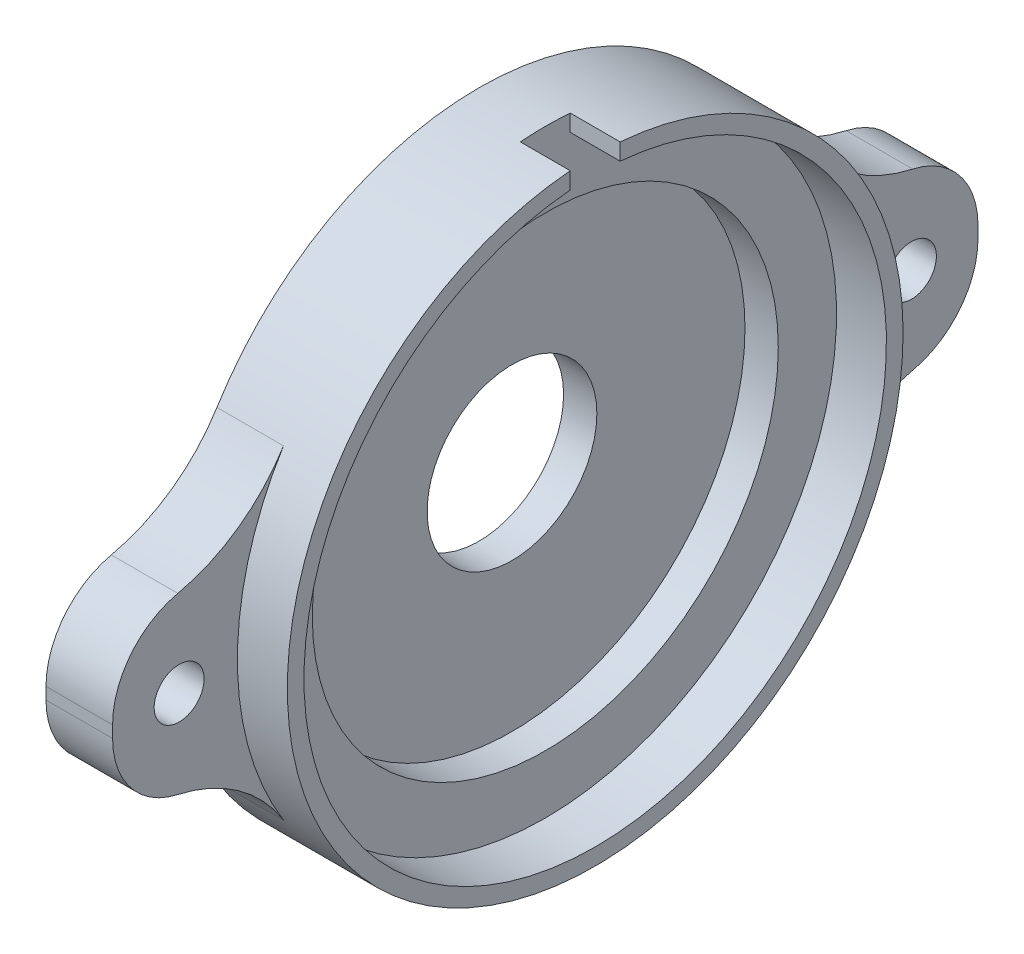
ISO-10303-21;
HEADER;
FILE_DESCRIPTION(('STEP AP214'),'2;1');
FILE_NAME('part.step','',(''),(''),'','','');
FILE_SCHEMA(('AUTOMOTIVE_DESIGN { 1 0 10303 214 1 1 1 1 }'));
ENDSEC;
DATA;
#1=APPLICATION_CONTEXT('core data for automotive mechanical design processes');
#2=APPLICATION_PROTOCOL_DEFINITION('international standard','automotive_design',2000,#1);
#3=PRODUCT_CONTEXT('',#1,'mechanical');
#4=PRODUCT('Part','Part','',(#3));
#5=PRODUCT_RELATED_PRODUCT_CATEGORY('part','',(#4));
#6=PRODUCT_DEFINITION_FORMATION('','',#4);
#7=PRODUCT_DEFINITION_CONTEXT('part definition',#1,'design');
#8=PRODUCT_DEFINITION('design','',#6,#7);
#9=PRODUCT_DEFINITION_SHAPE('','',#8);
#10=(LENGTH_UNIT() NAMED_UNIT(*) SI_UNIT(.MILLI.,.METRE.));
#11=(NAMED_UNIT(*) PLANE_ANGLE_UNIT() SI_UNIT($,.RADIAN.));
#12=(NAMED_UNIT(*) SI_UNIT($,.STERADIAN.) SOLID_ANGLE_UNIT());
#13=UNCERTAINTY_MEASURE_WITH_UNIT(LENGTH_MEASURE(1.E-05),#10,'distance_accuracy_value','');
#14=(GEOMETRIC_REPRESENTATION_CONTEXT(3) GLOBAL_UNCERTAINTY_ASSIGNED_CONTEXT((#13)) GLOBAL_UNIT_ASSIGNED_CONTEXT((#10,
#11,#12)) REPRESENTATION_CONTEXT('',''));
#15=CARTESIAN_POINT('',(0.,0.,0.));
#16=DIRECTION('',(0.,0.,1.));
#17=DIRECTION('',(1.,0.,0.));
#18=AXIS2_PLACEMENT_3D('',#15,#16,#17);
#19=CARTESIAN_POINT('',(7.,0.,0.));
#20=DIRECTION('',(-1.,0.,0.));
#21=DIRECTION('',(0.,0.,1.));
#22=AXIS2_PLACEMENT_3D('',#19,#20,#21);
#23=CYLINDRICAL_SURFACE('',#22,18.5);
#24=CARTESIAN_POINT('',(7.,0.,0.));
#25=DIRECTION('',(1.,0.,0.));
#26=DIRECTION('',(0.,0.,-1.));
#27=AXIS2_PLACEMENT_3D('',#24,#25,#26);
#28=CIRCLE('',#27,18.5);
#29=CARTESIAN_POINT('',(7.,18.4390889145858,1.5));
#30=VERTEX_POINT('',#29);
#31=CARTESIAN_POINT('',(7.,18.4390889145858,-1.5));
#32=VERTEX_POINT('',#31);
#33=EDGE_CURVE('E219',#30,#32,#28,.T.);
#34=ORIENTED_EDGE('',*,*,#33,.F.);
#35=DIRECTION('',(-1.,0.,0.));
#36=VECTOR('',#35,1.);
#37=CARTESIAN_POINT('',(7.,18.4390889145858,1.5));
#38=LINE('',#37,#36);
#39=CARTESIAN_POINT('',(4.,18.4390889145858,1.5));
#40=VERTEX_POINT('',#39);
#41=EDGE_CURVE('E173',#30,#40,#38,.T.);
#42=ORIENTED_EDGE('',*,*,#41,.T.);
#43=CARTESIAN_POINT('',(4.,0.,0.));
#44=DIRECTION('',(1.,0.,0.));
#45=DIRECTION('',(0.,0.,-1.));
#46=AXIS2_PLACEMENT_3D('',#43,#44,#45);
#47=CIRCLE('',#46,18.5);
#48=CARTESIAN_POINT('',(4.,18.4390889145858,-1.5));
#49=VERTEX_POINT('',#48);
#50=EDGE_CURVE('E167',#49,#40,#47,.T.);
#51=ORIENTED_EDGE('',*,*,#50,.F.);
#52=DIRECTION('',(-1.,0.,0.));
#53=VECTOR('',#52,1.);
#54=CARTESIAN_POINT('',(7.,18.4390889145858,-1.5));
#55=LINE('',#54,#53);
#56=EDGE_CURVE('E151',#49,#32,#55,.F.);
#57=ORIENTED_EDGE('',*,*,#56,.T.);
#58=EDGE_LOOP('',(#34,#42,#51,#57));
#59=FACE_BOUND('',#58,.T.);
#60=CARTESIAN_POINT('',(4.,0.,0.));
#61=DIRECTION('',(-1.,0.,0.));
#62=DIRECTION('',(0.,0.,1.));
#63=AXIS2_PLACEMENT_3D('',#60,#61,#62);
#64=CIRCLE('',#63,18.5);
#65=CARTESIAN_POINT('',(4.,9.73684210526315,-15.7303498313666));
#66=VERTEX_POINT('',#65);
#67=CARTESIAN_POINT('',(4.,-9.73684210526316,-15.7303498313666));
#68=VERTEX_POINT('',#67);
#69=EDGE_CURVE('E226',#66,#68,#64,.T.);
#70=ORIENTED_EDGE('',*,*,#69,.F.);
#71=DIRECTION('',(-1.,0.,0.));
#72=VECTOR('',#71,1.);
#73=CARTESIAN_POINT('',(7.,9.73684210526315,-15.7303498313666));
#74=LINE('',#73,#72);
#75=CARTESIAN_POINT('',(0.,9.73684210526315,-15.7303498313666));
#76=VERTEX_POINT('',#75);
#77=EDGE_CURVE('E236',#66,#76,#74,.T.);
#78=ORIENTED_EDGE('',*,*,#77,.T.);
#79=CARTESIAN_POINT('',(0.,0.,0.));
#80=DIRECTION('',(1.,0.,0.));
#81=DIRECTION('',(0.,0.,-1.));
#82=AXIS2_PLACEMENT_3D('',#79,#80,#81);
#83=CIRCLE('',#82,18.5);
#84=CARTESIAN_POINT('',(0.,9.73684210526316,15.7303498313666));
#85=VERTEX_POINT('',#84);
#86=EDGE_CURVE('E222',#76,#85,#83,.T.);
#87=ORIENTED_EDGE('',*,*,#86,.T.);
#88=DIRECTION('',(-1.,0.,0.));
#89=VECTOR('',#88,1.);
#90=CARTESIAN_POINT('',(7.,9.73684210526316,15.7303498313666));
#91=LINE('',#90,#89);
#92=CARTESIAN_POINT('',(4.,9.73684210526316,15.7303498313666));
#93=VERTEX_POINT('',#92);
#94=EDGE_CURVE('E227',#85,#93,#91,.F.);
#95=ORIENTED_EDGE('',*,*,#94,.T.);
#96=CARTESIAN_POINT('',(4.,-9.73684210526316,15.7303498313666));
#97=VERTEX_POINT('',#96);
#98=EDGE_CURVE('E221',#97,#93,#64,.T.);
#99=ORIENTED_EDGE('',*,*,#98,.F.);
#100=DIRECTION('',(-1.,0.,0.));
#101=VECTOR('',#100,1.);
#102=CARTESIAN_POINT('',(7.,-9.73684210526316,15.7303498313666));
#103=LINE('',#102,#101);
#104=CARTESIAN_POINT('',(0.,-9.73684210526316,15.7303498313666));
#105=VERTEX_POINT('',#104);
#106=EDGE_CURVE('E230',#97,#105,#103,.T.);
#107=ORIENTED_EDGE('',*,*,#106,.T.);
#108=CARTESIAN_POINT('',(0.,-9.73684210526316,-15.7303498313666));
#109=VERTEX_POINT('',#108);
#110=EDGE_CURVE('E214',#105,#109,#83,.T.);
#111=ORIENTED_EDGE('',*,*,#110,.T.);
#112=DIRECTION('',(-1.,0.,0.));
#113=VECTOR('',#112,1.);
#114=CARTESIAN_POINT('',(7.,-9.73684210526316,-15.7303498313666));
#115=LINE('',#114,#113);
#116=EDGE_CURVE('E233',#109,#68,#115,.F.);
#117=ORIENTED_EDGE('',*,*,#116,.T.);
#118=EDGE_LOOP('',(#70,#78,#87,#95,#99,#107,#111,#117));
#119=FACE_BOUND('',#118,.T.);
#120=ADVANCED_FACE('F37',(#59,#119),#23,.T.);
#121=CARTESIAN_POINT('',(7.,0.,0.));
#122=DIRECTION('',(1.,0.,0.));
#123=DIRECTION('',(0.,0.,-1.));
#124=AXIS2_PLACEMENT_3D('',#121,#122,#123);
#125=PLANE('',#124);
#126=DIRECTION('',(0.,-1.,0.));
#127=VECTOR('',#126,1.);
#128=CARTESIAN_POINT('',(7.,19.1883057553872,1.5));
#129=LINE('',#128,#127);
#130=CARTESIAN_POINT('',(7.,17.4355957741627,1.5));
#131=VERTEX_POINT('',#130);
#132=EDGE_CURVE('E575',#30,#131,#129,.T.);
#133=ORIENTED_EDGE('',*,*,#132,.F.);
#134=ORIENTED_EDGE('',*,*,#33,.T.);
#135=DIRECTION('',(0.,1.,0.));
#136=VECTOR('',#135,1.);
#137=CARTESIAN_POINT('',(7.,19.1883057553872,-1.5));
#138=LINE('',#137,#136);
#139=CARTESIAN_POINT('',(7.,17.4355957741627,-1.5));
#140=VERTEX_POINT('',#139);
#141=EDGE_CURVE('E157',#140,#32,#138,.T.);
#142=ORIENTED_EDGE('',*,*,#141,.F.);
#143=CARTESIAN_POINT('',(7.,0.,0.));
#144=DIRECTION('',(1.,0.,0.));
#145=DIRECTION('',(0.,0.,-1.));
#146=AXIS2_PLACEMENT_3D('',#143,#144,#145);
#147=CIRCLE('',#146,17.5);
#148=EDGE_CURVE('E200',#131,#140,#147,.T.);
#149=ORIENTED_EDGE('',*,*,#148,.F.);
#150=EDGE_LOOP('',(#133,#134,#142,#149));
#151=FACE_BOUND('',#150,.T.);
#152=ADVANCED_FACE('F349',(#151),#125,.T.);
#153=CARTESIAN_POINT('',(0.,0.,0.));
#154=DIRECTION('',(1.,0.,0.));
#155=DIRECTION('',(0.,0.,-1.));
#156=AXIS2_PLACEMENT_3D('',#153,#154,#155);
#157=PLANE('',#156);
#158=CARTESIAN_POINT('',(0.,0.,22.));
#159=DIRECTION('',(1.,0.,0.));
#160=DIRECTION('',(0.,0.,-1.));
#161=AXIS2_PLACEMENT_3D('',#158,#159,#160);
#162=CIRCLE('',#161,1.5);
#163=CARTESIAN_POINT('',(0.,0.,20.5));
#164=VERTEX_POINT('',#163);
#165=EDGE_CURVE('E185',#164,#164,#162,.F.);
#166=ORIENTED_EDGE('',*,*,#165,.F.);
#167=EDGE_LOOP('',(#166));
#168=FACE_BOUND('',#167,.T.);
#169=CARTESIAN_POINT('',(0.,0.,-22.));
#170=DIRECTION('',(1.,0.,0.));
#171=DIRECTION('',(0.,0.,-1.));
#172=AXIS2_PLACEMENT_3D('',#169,#170,#171);
#173=CIRCLE('',#172,1.5);
#174=CARTESIAN_POINT('',(0.,0.,-23.5));
#175=VERTEX_POINT('',#174);
#176=EDGE_CURVE('E177',#175,#175,#173,.F.);
#177=ORIENTED_EDGE('',*,*,#176,.F.);
#178=EDGE_LOOP('',(#177));
#179=FACE_BOUND('',#178,.T.);
#180=CARTESIAN_POINT('',(0.,0.,0.));
#181=DIRECTION('',(1.,0.,0.));
#182=DIRECTION('',(0.,0.,-1.));
#183=AXIS2_PLACEMENT_3D('',#180,#181,#182);
#184=CIRCLE('',#183,5.1);
#185=CARTESIAN_POINT('',(0.,0.,-5.1));
#186=VERTEX_POINT('',#185);
#187=EDGE_CURVE('E193',#186,#186,#184,.F.);
#188=ORIENTED_EDGE('',*,*,#187,.F.);
#189=EDGE_LOOP('',(#188));
#190=FACE_BOUND('',#189,.T.);
#191=DIRECTION('',(0.,1.,0.));
#192=VECTOR('',#191,1.);
#193=CARTESIAN_POINT('',(0.,5.,26.));
#194=LINE('',#193,#192);
#195=CARTESIAN_POINT('',(0.,-0.352606083387349,26.));
#196=VERTEX_POINT('',#195);
#197=CARTESIAN_POINT('',(0.,0.352606083387353,26.));
#198=VERTEX_POINT('',#197);
#199=EDGE_CURVE('E211',#196,#198,#194,.T.);
#200=ORIENTED_EDGE('',*,*,#199,.T.);
#201=CARTESIAN_POINT('',(0.,0.352606083387353,21.));
#202=DIRECTION('',(1.,0.,0.));
#203=DIRECTION('',(0.,0.,-1.));
#204=AXIS2_PLACEMENT_3D('',#201,#202,#203);
#205=CIRCLE('',#204,5.);
#206=CARTESIAN_POINT('',(0.,5.23507072225824,22.0777472107018));
#207=VERTEX_POINT('',#206);
#208=EDGE_CURVE('E270',#198,#207,#205,.F.);
#209=ORIENTED_EDGE('',*,*,#208,.T.);
#210=CARTESIAN_POINT('',(0.,15.,24.2332416321053));
#211=DIRECTION('',(1.,0.,0.));
#212=DIRECTION('',(0.,0.,-1.));
#213=AXIS2_PLACEMENT_3D('',#210,#211,#212);
#214=CIRCLE('',#213,10.);
#215=EDGE_CURVE('E257',#207,#85,#214,.T.);
#216=ORIENTED_EDGE('',*,*,#215,.T.);
#217=ORIENTED_EDGE('',*,*,#86,.F.);
#218=CARTESIAN_POINT('',(0.,15.,-24.2332416321053));
#219=DIRECTION('',(1.,0.,0.));
#220=DIRECTION('',(0.,0.,-1.));
#221=AXIS2_PLACEMENT_3D('',#218,#219,#220);
#222=CIRCLE('',#221,10.);
#223=CARTESIAN_POINT('',(0.,5.23507072225823,-22.0777472107018));
#224=VERTEX_POINT('',#223);
#225=EDGE_CURVE('E239',#76,#224,#222,.T.);
#226=ORIENTED_EDGE('',*,*,#225,.T.);
#227=CARTESIAN_POINT('',(0.,0.352606083387347,-21.));
#228=DIRECTION('',(1.,0.,0.));
#229=DIRECTION('',(0.,0.,-1.));
#230=AXIS2_PLACEMENT_3D('',#227,#228,#229);
#231=CIRCLE('',#230,5.);
#232=CARTESIAN_POINT('',(0.,0.352606083387347,-26.));
#233=VERTEX_POINT('',#232);
#234=EDGE_CURVE('E264',#224,#233,#231,.F.);
#235=ORIENTED_EDGE('',*,*,#234,.T.);
#236=DIRECTION('',(0.,-1.,0.));
#237=VECTOR('',#236,1.);
#238=CARTESIAN_POINT('',(0.,5.,-26.));
#239=LINE('',#238,#237);
#240=CARTESIAN_POINT('',(0.,-0.352606083387349,-26.));
#241=VERTEX_POINT('',#240);
#242=EDGE_CURVE('E204',#233,#241,#239,.T.);
#243=ORIENTED_EDGE('',*,*,#242,.T.);
#244=CARTESIAN_POINT('',(0.,-0.352606083387349,-21.));
#245=DIRECTION('',(1.,0.,0.));
#246=DIRECTION('',(0.,0.,-1.));
#247=AXIS2_PLACEMENT_3D('',#244,#245,#246);
#248=CIRCLE('',#247,5.);
#249=CARTESIAN_POINT('',(0.,-5.23507072225823,-22.0777472107018));
#250=VERTEX_POINT('',#249);
#251=EDGE_CURVE('E266',#241,#250,#248,.F.);
#252=ORIENTED_EDGE('',*,*,#251,.T.);
#253=CARTESIAN_POINT('',(0.,-15.,-24.2332416321053));
#254=DIRECTION('',(1.,0.,0.));
#255=DIRECTION('',(0.,0.,-1.));
#256=AXIS2_PLACEMENT_3D('',#253,#254,#255);
#257=CIRCLE('',#256,10.);
#258=EDGE_CURVE('E247',#250,#109,#257,.T.);
#259=ORIENTED_EDGE('',*,*,#258,.T.);
#260=ORIENTED_EDGE('',*,*,#110,.F.);
#261=CARTESIAN_POINT('',(0.,-15.,24.2332416321053));
#262=DIRECTION('',(1.,0.,0.));
#263=DIRECTION('',(0.,0.,-1.));
#264=AXIS2_PLACEMENT_3D('',#261,#262,#263);
#265=CIRCLE('',#264,10.);
#266=CARTESIAN_POINT('',(0.,-5.23507072225823,22.0777472107018));
#267=VERTEX_POINT('',#266);
#268=EDGE_CURVE('E249',#105,#267,#265,.T.);
#269=ORIENTED_EDGE('',*,*,#268,.T.);
#270=CARTESIAN_POINT('',(0.,-0.352606083387349,21.));
#271=DIRECTION('',(1.,0.,0.));
#272=DIRECTION('',(0.,0.,-1.));
#273=AXIS2_PLACEMENT_3D('',#270,#271,#272);
#274=CIRCLE('',#273,5.);
#275=EDGE_CURVE('E268',#267,#196,#274,.F.);
#276=ORIENTED_EDGE('',*,*,#275,.T.);
#277=EDGE_LOOP('',(#200,#209,#216,#217,#226,#235,#243,#252,#259,#260,#269,#276));
#278=FACE_BOUND('',#277,.T.);
#279=ADVANCED_FACE('F301',(#168,#179,#190,#278),#157,.F.);
#280=CARTESIAN_POINT('',(4.,5.,26.));
#281=DIRECTION('',(0.,0.,1.));
#282=DIRECTION('',(1.,0.,0.));
#283=AXIS2_PLACEMENT_3D('',#280,#281,#282);
#284=PLANE('',#283);
#285=DIRECTION('',(0.,1.,0.));
#286=VECTOR('',#285,1.);
#287=CARTESIAN_POINT('',(4.,5.,26.));
#288=LINE('',#287,#286);
#289=CARTESIAN_POINT('',(4.,-0.352606083387349,26.));
#290=VERTEX_POINT('',#289);
#291=CARTESIAN_POINT('',(4.,0.352606083387353,26.));
#292=VERTEX_POINT('',#291);
#293=EDGE_CURVE('E210',#290,#292,#288,.T.);
#294=ORIENTED_EDGE('',*,*,#293,.T.);
#295=DIRECTION('',(1.,0.,0.));
#296=VECTOR('',#295,1.);
#297=CARTESIAN_POINT('',(0.,0.352606083387353,26.));
#298=LINE('',#297,#296);
#299=EDGE_CURVE('E261',#292,#198,#298,.F.);
#300=ORIENTED_EDGE('',*,*,#299,.T.);
#301=ORIENTED_EDGE('',*,*,#199,.F.);
#302=DIRECTION('',(1.,0.,0.));
#303=VECTOR('',#302,1.);
#304=CARTESIAN_POINT('',(4.,-0.352606083387349,26.));
#305=LINE('',#304,#303);
#306=EDGE_CURVE('E259',#196,#290,#305,.T.);
#307=ORIENTED_EDGE('',*,*,#306,.T.);
#308=EDGE_LOOP('',(#294,#300,#301,#307));
#309=FACE_BOUND('',#308,.T.);
#310=ADVANCED_FACE('F321',(#309),#284,.T.);
#311=CARTESIAN_POINT('',(4.,0.,0.));
#312=DIRECTION('',(-1.,0.,0.));
#313=DIRECTION('',(0.,0.,1.));
#314=AXIS2_PLACEMENT_3D('',#311,#312,#313);
#315=PLANE('',#314);
#316=CARTESIAN_POINT('',(4.,0.,22.));
#317=DIRECTION('',(1.,0.,0.));
#318=DIRECTION('',(0.,0.,-1.));
#319=AXIS2_PLACEMENT_3D('',#316,#317,#318);
#320=CIRCLE('',#319,1.5);
#321=CARTESIAN_POINT('',(4.,0.,20.5));
#322=VERTEX_POINT('',#321);
#323=EDGE_CURVE('E182',#322,#322,#320,.T.);
#324=ORIENTED_EDGE('',*,*,#323,.F.);
#325=EDGE_LOOP('',(#324));
#326=FACE_BOUND('',#325,.T.);
#327=CARTESIAN_POINT('',(4.,15.,24.2332416321053));
#328=DIRECTION('',(-1.,0.,0.));
#329=DIRECTION('',(0.,0.,1.));
#330=AXIS2_PLACEMENT_3D('',#327,#328,#329);
#331=CIRCLE('',#330,10.);
#332=CARTESIAN_POINT('',(4.,5.23507072225824,22.0777472107018));
#333=VERTEX_POINT('',#332);
#334=EDGE_CURVE('E254',#93,#333,#331,.T.);
#335=ORIENTED_EDGE('',*,*,#334,.T.);
#336=CARTESIAN_POINT('',(4.,0.352606083387353,21.));
#337=DIRECTION('',(-1.,0.,0.));
#338=DIRECTION('',(0.,0.,1.));
#339=AXIS2_PLACEMENT_3D('',#336,#337,#338);
#340=CIRCLE('',#339,5.);
#341=EDGE_CURVE('E276',#333,#292,#340,.F.);
#342=ORIENTED_EDGE('',*,*,#341,.T.);
#343=ORIENTED_EDGE('',*,*,#293,.F.);
#344=CARTESIAN_POINT('',(4.,-0.352606083387349,21.));
#345=DIRECTION('',(-1.,0.,0.));
#346=DIRECTION('',(0.,0.,1.));
#347=AXIS2_PLACEMENT_3D('',#344,#345,#346);
#348=CIRCLE('',#347,5.);
#349=CARTESIAN_POINT('',(4.,-5.23507072225823,22.0777472107018));
#350=VERTEX_POINT('',#349);
#351=EDGE_CURVE('E274',#290,#350,#348,.F.);
#352=ORIENTED_EDGE('',*,*,#351,.T.);
#353=CARTESIAN_POINT('',(4.,-15.,24.2332416321053));
#354=DIRECTION('',(-1.,0.,0.));
#355=DIRECTION('',(0.,0.,1.));
#356=AXIS2_PLACEMENT_3D('',#353,#354,#355);
#357=CIRCLE('',#356,10.);
#358=EDGE_CURVE('E252',#350,#97,#357,.T.);
#359=ORIENTED_EDGE('',*,*,#358,.T.);
#360=ORIENTED_EDGE('',*,*,#98,.T.);
#361=EDGE_LOOP('',(#335,#342,#343,#352,#359,#360));
#362=FACE_BOUND('',#361,.T.);
#363=ADVANCED_FACE('F324',(#326,#362),#315,.F.);
#364=CARTESIAN_POINT('',(4.,0.,-22.));
#365=DIRECTION('',(1.,0.,0.));
#366=DIRECTION('',(0.,0.,-1.));
#367=AXIS2_PLACEMENT_3D('',#364,#365,#366);
#368=CIRCLE('',#367,1.5);
#369=CARTESIAN_POINT('',(4.,0.,-23.5));
#370=VERTEX_POINT('',#369);
#371=EDGE_CURVE('E174',#370,#370,#368,.T.);
#372=ORIENTED_EDGE('',*,*,#371,.F.);
#373=EDGE_LOOP('',(#372));
#374=FACE_BOUND('',#373,.T.);
#375=CARTESIAN_POINT('',(4.,-15.,-24.2332416321053));
#376=DIRECTION('',(-1.,0.,0.));
#377=DIRECTION('',(0.,0.,1.));
#378=AXIS2_PLACEMENT_3D('',#375,#376,#377);
#379=CIRCLE('',#378,10.);
#380=CARTESIAN_POINT('',(4.,-5.23507072225823,-22.0777472107018));
#381=VERTEX_POINT('',#380);
#382=EDGE_CURVE('E244',#68,#381,#379,.T.);
#383=ORIENTED_EDGE('',*,*,#382,.T.);
#384=CARTESIAN_POINT('',(4.,-0.352606083387349,-21.));
#385=DIRECTION('',(-1.,0.,0.));
#386=DIRECTION('',(0.,0.,1.));
#387=AXIS2_PLACEMENT_3D('',#384,#385,#386);
#388=CIRCLE('',#387,5.);
#389=CARTESIAN_POINT('',(4.,-0.352606083387349,-26.));
#390=VERTEX_POINT('',#389);
#391=EDGE_CURVE('E45',#381,#390,#388,.F.);
#392=ORIENTED_EDGE('',*,*,#391,.T.);
#393=DIRECTION('',(0.,-1.,0.));
#394=VECTOR('',#393,1.);
#395=CARTESIAN_POINT('',(4.,5.,-26.));
#396=LINE('',#395,#394);
#397=CARTESIAN_POINT('',(4.,0.352606083387347,-26.));
#398=VERTEX_POINT('',#397);
#399=EDGE_CURVE('E207',#398,#390,#396,.T.);
#400=ORIENTED_EDGE('',*,*,#399,.F.);
#401=CARTESIAN_POINT('',(4.,0.352606083387347,-21.));
#402=DIRECTION('',(-1.,0.,0.));
#403=DIRECTION('',(0.,0.,1.));
#404=AXIS2_PLACEMENT_3D('',#401,#402,#403);
#405=CIRCLE('',#404,5.);
#406=CARTESIAN_POINT('',(4.,5.23507072225823,-22.0777472107018));
#407=VERTEX_POINT('',#406);
#408=EDGE_CURVE('E60',#398,#407,#405,.F.);
#409=ORIENTED_EDGE('',*,*,#408,.T.);
#410=CARTESIAN_POINT('',(4.,15.,-24.2332416321053));
#411=DIRECTION('',(-1.,0.,0.));
#412=DIRECTION('',(0.,0.,1.));
#413=AXIS2_PLACEMENT_3D('',#410,#411,#412);
#414=CIRCLE('',#413,10.);
#415=EDGE_CURVE('E242',#407,#66,#414,.T.);
#416=ORIENTED_EDGE('',*,*,#415,.T.);
#417=ORIENTED_EDGE('',*,*,#69,.T.);
#418=EDGE_LOOP('',(#383,#392,#400,#409,#416,#417));
#419=FACE_BOUND('',#418,.T.);
#420=ADVANCED_FACE('F289',(#374,#419),#315,.F.);
#421=CARTESIAN_POINT('',(4.,5.,-26.));
#422=DIRECTION('',(0.,0.,-1.));
#423=DIRECTION('',(-1.,0.,0.));
#424=AXIS2_PLACEMENT_3D('',#421,#422,#423);
#425=PLANE('',#424);
#426=ORIENTED_EDGE('',*,*,#399,.T.);
#427=DIRECTION('',(1.,0.,0.));
#428=VECTOR('',#427,1.);
#429=CARTESIAN_POINT('',(0.,-0.352606083387349,-26.));
#430=LINE('',#429,#428);
#431=EDGE_CURVE('E283',#390,#241,#430,.F.);
#432=ORIENTED_EDGE('',*,*,#431,.T.);
#433=ORIENTED_EDGE('',*,*,#242,.F.);
#434=DIRECTION('',(1.,0.,0.));
#435=VECTOR('',#434,1.);
#436=CARTESIAN_POINT('',(4.,0.352606083387347,-26.));
#437=LINE('',#436,#435);
#438=EDGE_CURVE('E281',#233,#398,#437,.T.);
#439=ORIENTED_EDGE('',*,*,#438,.T.);
#440=EDGE_LOOP('',(#426,#432,#433,#439));
#441=FACE_BOUND('',#440,.T.);
#442=ADVANCED_FACE('F295',(#441),#425,.T.);
#443=CARTESIAN_POINT('',(4.,0.,0.));
#444=DIRECTION('',(1.,0.,0.));
#445=DIRECTION('',(0.,0.,-1.));
#446=AXIS2_PLACEMENT_3D('',#443,#444,#445);
#447=CYLINDRICAL_SURFACE('',#446,17.5);
#448=CARTESIAN_POINT('',(4.,0.,0.));
#449=DIRECTION('',(1.,0.,0.));
#450=DIRECTION('',(0.,0.,-1.));
#451=AXIS2_PLACEMENT_3D('',#448,#449,#450);
#452=CIRCLE('',#451,17.5);
#453=CARTESIAN_POINT('',(4.,17.4355957741627,1.5));
#454=VERTEX_POINT('',#453);
#455=CARTESIAN_POINT('',(4.,17.4355957741627,-1.5));
#456=VERTEX_POINT('',#455);
#457=EDGE_CURVE('E169',#454,#456,#452,.T.);
#458=ORIENTED_EDGE('',*,*,#457,.F.);
#459=DIRECTION('',(1.,0.,0.));
#460=VECTOR('',#459,1.);
#461=CARTESIAN_POINT('',(4.,17.4355957741627,1.5));
#462=LINE('',#461,#460);
#463=EDGE_CURVE('E162',#454,#131,#462,.T.);
#464=ORIENTED_EDGE('',*,*,#463,.T.);
#465=ORIENTED_EDGE('',*,*,#148,.T.);
#466=DIRECTION('',(1.,0.,0.));
#467=VECTOR('',#466,1.);
#468=CARTESIAN_POINT('',(4.,17.4355957741627,-1.5));
#469=LINE('',#468,#467);
#470=EDGE_CURVE('E163',#140,#456,#469,.F.);
#471=ORIENTED_EDGE('',*,*,#470,.T.);
#472=EDGE_LOOP('',(#458,#464,#465,#471));
#473=FACE_BOUND('',#472,.T.);
#474=ADVANCED_FACE('F400',(#473),#447,.F.);
#475=CARTESIAN_POINT('',(4.,0.,0.));
#476=DIRECTION('',(1.,0.,0.));
#477=DIRECTION('',(0.,0.,-1.));
#478=AXIS2_PLACEMENT_3D('',#475,#476,#477);
#479=PLANE('',#478);
#480=ORIENTED_EDGE('',*,*,#457,.T.);
#481=DIRECTION('',(0.,-1.,0.));
#482=VECTOR('',#481,1.);
#483=CARTESIAN_POINT('',(4.,19.1883057553872,-1.5));
#484=LINE('',#483,#482);
#485=EDGE_CURVE('E154',#49,#456,#484,.T.);
#486=ORIENTED_EDGE('',*,*,#485,.F.);
#487=ORIENTED_EDGE('',*,*,#50,.T.);
#488=DIRECTION('',(0.,1.,0.));
#489=VECTOR('',#488,1.);
#490=CARTESIAN_POINT('',(4.,19.1883057553872,1.5));
#491=LINE('',#490,#489);
#492=EDGE_CURVE('E52',#454,#40,#491,.T.);
#493=ORIENTED_EDGE('',*,*,#492,.F.);
#494=EDGE_LOOP('',(#480,#486,#487,#493));
#495=FACE_BOUND('',#494,.T.);
#496=CARTESIAN_POINT('',(4.,0.,0.));
#497=DIRECTION('',(1.,0.,0.));
#498=DIRECTION('',(0.,0.,-1.));
#499=AXIS2_PLACEMENT_3D('',#496,#497,#498);
#500=CIRCLE('',#499,14.);
#501=CARTESIAN_POINT('',(4.,0.,-14.));
#502=VERTEX_POINT('',#501);
#503=EDGE_CURVE('E196',#502,#502,#500,.T.);
#504=ORIENTED_EDGE('',*,*,#503,.F.);
#505=EDGE_LOOP('',(#504));
#506=FACE_BOUND('',#505,.T.);
#507=ADVANCED_FACE('F165',(#495,#506),#479,.T.);
#508=CARTESIAN_POINT('',(2.,0.,0.));
#509=DIRECTION('',(1.,0.,0.));
#510=DIRECTION('',(0.,0.,-1.));
#511=AXIS2_PLACEMENT_3D('',#508,#509,#510);
#512=CYLINDRICAL_SURFACE('',#511,14.);
#513=CARTESIAN_POINT('',(2.,0.,0.));
#514=DIRECTION('',(1.,0.,0.));
#515=DIRECTION('',(0.,0.,-1.));
#516=AXIS2_PLACEMENT_3D('',#513,#514,#515);
#517=CIRCLE('',#516,14.);
#518=CARTESIAN_POINT('',(2.,0.,-14.));
#519=VERTEX_POINT('',#518);
#520=EDGE_CURVE('E197',#519,#519,#517,.T.);
#521=ORIENTED_EDGE('',*,*,#520,.F.);
#522=EDGE_LOOP('',(#521));
#523=FACE_BOUND('',#522,.T.);
#524=ORIENTED_EDGE('',*,*,#503,.T.);
#525=EDGE_LOOP('',(#524));
#526=FACE_BOUND('',#525,.T.);
#527=ADVANCED_FACE('F416',(#523,#526),#512,.F.);
#528=CARTESIAN_POINT('',(2.,0.,0.));
#529=DIRECTION('',(1.,0.,0.));
#530=DIRECTION('',(0.,0.,-1.));
#531=AXIS2_PLACEMENT_3D('',#528,#529,#530);
#532=PLANE('',#531);
#533=CARTESIAN_POINT('',(2.,0.,0.));
#534=DIRECTION('',(1.,0.,0.));
#535=DIRECTION('',(0.,0.,-1.));
#536=AXIS2_PLACEMENT_3D('',#533,#534,#535);
#537=CIRCLE('',#536,5.1);
#538=CARTESIAN_POINT('',(2.,0.,-5.1));
#539=VERTEX_POINT('',#538);
#540=EDGE_CURVE('E187',#539,#539,#537,.T.);
#541=ORIENTED_EDGE('',*,*,#540,.F.);
#542=EDGE_LOOP('',(#541));
#543=FACE_BOUND('',#542,.T.);
#544=ORIENTED_EDGE('',*,*,#520,.T.);
#545=EDGE_LOOP('',(#544));
#546=FACE_BOUND('',#545,.T.);
#547=ADVANCED_FACE('F446',(#543,#546),#532,.T.);
#548=CARTESIAN_POINT('',(-0.00100000000000013,0.,0.));
#549=DIRECTION('',(1.,0.,0.));
#550=DIRECTION('',(0.,0.,-1.));
#551=AXIS2_PLACEMENT_3D('',#548,#549,#550);
#552=CYLINDRICAL_SURFACE('',#551,5.1);
#553=ORIENTED_EDGE('',*,*,#540,.T.);
#554=EDGE_LOOP('',(#553));
#555=FACE_BOUND('',#554,.T.);
#556=ORIENTED_EDGE('',*,*,#187,.T.);
#557=EDGE_LOOP('',(#556));
#558=FACE_BOUND('',#557,.T.);
#559=ADVANCED_FACE('F442',(#555,#558),#552,.F.);
#560=CARTESIAN_POINT('',(-0.00100000000000013,0.,-22.));
#561=DIRECTION('',(1.,0.,0.));
#562=DIRECTION('',(0.,0.,-1.));
#563=AXIS2_PLACEMENT_3D('',#560,#561,#562);
#564=CYLINDRICAL_SURFACE('',#563,1.5);
#565=ORIENTED_EDGE('',*,*,#371,.T.);
#566=EDGE_LOOP('',(#565));
#567=FACE_BOUND('',#566,.T.);
#568=ORIENTED_EDGE('',*,*,#176,.T.);
#569=EDGE_LOOP('',(#568));
#570=FACE_BOUND('',#569,.T.);
#571=ADVANCED_FACE('F438',(#567,#570),#564,.F.);
#572=CARTESIAN_POINT('',(-0.00100000000000013,0.,22.));
#573=DIRECTION('',(1.,0.,0.));
#574=DIRECTION('',(0.,0.,-1.));
#575=AXIS2_PLACEMENT_3D('',#572,#573,#574);
#576=CYLINDRICAL_SURFACE('',#575,1.5);
#577=ORIENTED_EDGE('',*,*,#323,.T.);
#578=EDGE_LOOP('',(#577));
#579=FACE_BOUND('',#578,.T.);
#580=ORIENTED_EDGE('',*,*,#165,.T.);
#581=EDGE_LOOP('',(#580));
#582=FACE_BOUND('',#581,.T.);
#583=ADVANCED_FACE('F360',(#579,#582),#576,.F.);
#584=CARTESIAN_POINT('',(7.,15.,-24.2332416321053));
#585=DIRECTION('',(-1.,0.,0.));
#586=DIRECTION('',(0.,0.,1.));
#587=AXIS2_PLACEMENT_3D('',#584,#585,#586);
#588=CYLINDRICAL_SURFACE('',#587,10.);
#589=ORIENTED_EDGE('',*,*,#415,.F.);
#590=DIRECTION('',(-1.,0.,0.));
#591=VECTOR('',#590,1.);
#592=CARTESIAN_POINT('',(7.,5.23507072225823,-22.0777472107018));
#593=LINE('',#592,#591);
#594=EDGE_CURVE('E11',#407,#224,#593,.T.);
#595=ORIENTED_EDGE('',*,*,#594,.T.);
#596=ORIENTED_EDGE('',*,*,#225,.F.);
#597=ORIENTED_EDGE('',*,*,#77,.F.);
#598=EDGE_LOOP('',(#589,#595,#596,#597));
#599=FACE_BOUND('',#598,.T.);
#600=ADVANCED_FACE('F337',(#599),#588,.F.);
#601=CARTESIAN_POINT('',(7.,-15.,-24.2332416321053));
#602=DIRECTION('',(-1.,0.,0.));
#603=DIRECTION('',(0.,0.,1.));
#604=AXIS2_PLACEMENT_3D('',#601,#602,#603);
#605=CYLINDRICAL_SURFACE('',#604,10.);
#606=ORIENTED_EDGE('',*,*,#258,.F.);
#607=DIRECTION('',(-1.,0.,0.));
#608=VECTOR('',#607,1.);
#609=CARTESIAN_POINT('',(7.,-5.23507072225823,-22.0777472107018));
#610=LINE('',#609,#608);
#611=EDGE_CURVE('E286',#250,#381,#610,.F.);
#612=ORIENTED_EDGE('',*,*,#611,.T.);
#613=ORIENTED_EDGE('',*,*,#382,.F.);
#614=ORIENTED_EDGE('',*,*,#116,.F.);
#615=EDGE_LOOP('',(#606,#612,#613,#614));
#616=FACE_BOUND('',#615,.T.);
#617=ADVANCED_FACE('F305',(#616),#605,.F.);
#618=CARTESIAN_POINT('',(7.,-15.,24.2332416321053));
#619=DIRECTION('',(-1.,0.,0.));
#620=DIRECTION('',(0.,0.,1.));
#621=AXIS2_PLACEMENT_3D('',#618,#619,#620);
#622=CYLINDRICAL_SURFACE('',#621,10.);
#623=ORIENTED_EDGE('',*,*,#358,.F.);
#624=DIRECTION('',(-1.,0.,0.));
#625=VECTOR('',#624,1.);
#626=CARTESIAN_POINT('',(7.,-5.23507072225823,22.0777472107018));
#627=LINE('',#626,#625);
#628=EDGE_CURVE('E278',#350,#267,#627,.T.);
#629=ORIENTED_EDGE('',*,*,#628,.T.);
#630=ORIENTED_EDGE('',*,*,#268,.F.);
#631=ORIENTED_EDGE('',*,*,#106,.F.);
#632=EDGE_LOOP('',(#623,#629,#630,#631));
#633=FACE_BOUND('',#632,.T.);
#634=ADVANCED_FACE('F313',(#633),#622,.F.);
#635=CARTESIAN_POINT('',(7.,15.,24.2332416321053));
#636=DIRECTION('',(-1.,0.,0.));
#637=DIRECTION('',(0.,0.,1.));
#638=AXIS2_PLACEMENT_3D('',#635,#636,#637);
#639=CYLINDRICAL_SURFACE('',#638,10.);
#640=ORIENTED_EDGE('',*,*,#215,.F.);
#641=DIRECTION('',(-1.,0.,0.));
#642=VECTOR('',#641,1.);
#643=CARTESIAN_POINT('',(7.,5.23507072225824,22.0777472107018));
#644=LINE('',#643,#642);
#645=EDGE_CURVE('E272',#207,#333,#644,.F.);
#646=ORIENTED_EDGE('',*,*,#645,.T.);
#647=ORIENTED_EDGE('',*,*,#334,.F.);
#648=ORIENTED_EDGE('',*,*,#94,.F.);
#649=EDGE_LOOP('',(#640,#646,#647,#648));
#650=FACE_BOUND('',#649,.T.);
#651=ADVANCED_FACE('F335',(#650),#639,.F.);
#652=CARTESIAN_POINT('',(7.,0.352606083387353,21.));
#653=DIRECTION('',(-1.,0.,0.));
#654=DIRECTION('',(0.,0.,1.));
#655=AXIS2_PLACEMENT_3D('',#652,#653,#654);
#656=CYLINDRICAL_SURFACE('',#655,5.);
#657=ORIENTED_EDGE('',*,*,#341,.F.);
#658=ORIENTED_EDGE('',*,*,#645,.F.);
#659=ORIENTED_EDGE('',*,*,#208,.F.);
#660=ORIENTED_EDGE('',*,*,#299,.F.);
#661=EDGE_LOOP('',(#657,#658,#659,#660));
#662=FACE_BOUND('',#661,.T.);
#663=ADVANCED_FACE('F329',(#662),#656,.T.);
#664=CARTESIAN_POINT('',(7.,-0.352606083387349,21.));
#665=DIRECTION('',(-1.,0.,0.));
#666=DIRECTION('',(0.,0.,1.));
#667=AXIS2_PLACEMENT_3D('',#664,#665,#666);
#668=CYLINDRICAL_SURFACE('',#667,5.);
#669=ORIENTED_EDGE('',*,*,#351,.F.);
#670=ORIENTED_EDGE('',*,*,#306,.F.);
#671=ORIENTED_EDGE('',*,*,#275,.F.);
#672=ORIENTED_EDGE('',*,*,#628,.F.);
#673=EDGE_LOOP('',(#669,#670,#671,#672));
#674=FACE_BOUND('',#673,.T.);
#675=ADVANCED_FACE('F317',(#674),#668,.T.);
#676=CARTESIAN_POINT('',(7.,-0.352606083387349,-21.));
#677=DIRECTION('',(-1.,0.,0.));
#678=DIRECTION('',(0.,0.,1.));
#679=AXIS2_PLACEMENT_3D('',#676,#677,#678);
#680=CYLINDRICAL_SURFACE('',#679,5.);
#681=ORIENTED_EDGE('',*,*,#391,.F.);
#682=ORIENTED_EDGE('',*,*,#611,.F.);
#683=ORIENTED_EDGE('',*,*,#251,.F.);
#684=ORIENTED_EDGE('',*,*,#431,.F.);
#685=EDGE_LOOP('',(#681,#682,#683,#684));
#686=FACE_BOUND('',#685,.T.);
#687=ADVANCED_FACE('F298',(#686),#680,.T.);
#688=CARTESIAN_POINT('',(7.,0.352606083387347,-21.));
#689=DIRECTION('',(-1.,0.,0.));
#690=DIRECTION('',(0.,0.,1.));
#691=AXIS2_PLACEMENT_3D('',#688,#689,#690);
#692=CYLINDRICAL_SURFACE('',#691,5.);
#693=ORIENTED_EDGE('',*,*,#408,.F.);
#694=ORIENTED_EDGE('',*,*,#438,.F.);
#695=ORIENTED_EDGE('',*,*,#234,.F.);
#696=ORIENTED_EDGE('',*,*,#594,.F.);
#697=EDGE_LOOP('',(#693,#694,#695,#696));
#698=FACE_BOUND('',#697,.T.);
#699=ADVANCED_FACE('F39',(#698),#692,.T.);
#700=CARTESIAN_POINT('',(0.2268997322357,19.1883057553872,1.5));
#701=DIRECTION('',(0.,0.,1.));
#702=DIRECTION('',(0.,-1.,0.));
#703=AXIS2_PLACEMENT_3D('',#700,#701,#702);
#704=PLANE('',#703);
#705=ORIENTED_EDGE('',*,*,#132,.T.);
#706=ORIENTED_EDGE('',*,*,#463,.F.);
#707=ORIENTED_EDGE('',*,*,#492,.T.);
#708=ORIENTED_EDGE('',*,*,#41,.F.);
#709=EDGE_LOOP('',(#705,#706,#707,#708));
#710=FACE_BOUND('',#709,.T.);
#711=ADVANCED_FACE('F341',(#710),#704,.F.);
#712=CARTESIAN_POINT('',(0.2268997322357,19.1883057553872,-1.5));
#713=DIRECTION('',(0.,0.,-1.));
#714=DIRECTION('',(0.,1.,0.));
#715=AXIS2_PLACEMENT_3D('',#712,#713,#714);
#716=PLANE('',#715);
#717=ORIENTED_EDGE('',*,*,#485,.T.);
#718=ORIENTED_EDGE('',*,*,#470,.F.);
#719=ORIENTED_EDGE('',*,*,#141,.T.);
#720=ORIENTED_EDGE('',*,*,#56,.F.);
#721=EDGE_LOOP('',(#717,#718,#719,#720));
#722=FACE_BOUND('',#721,.T.);
#723=ADVANCED_FACE('F153',(#722),#716,.F.);
#724=CLOSED_SHELL('',(#120,#152,#279,#310,#363,#420,#442,#474,#507,#527,#547,#559,#571,#583,
#600,#617,#634,#651,#663,#675,#687,#699,#711,#723));
#725=MANIFOLD_SOLID_BREP('B2',#724);
#726=ADVANCED_BREP_SHAPE_REPRESENTATION('',(#18,#725),#14);
#727=SHAPE_DEFINITION_REPRESENTATION(#9,#726);
ENDSEC;
END-ISO-10303-21;
